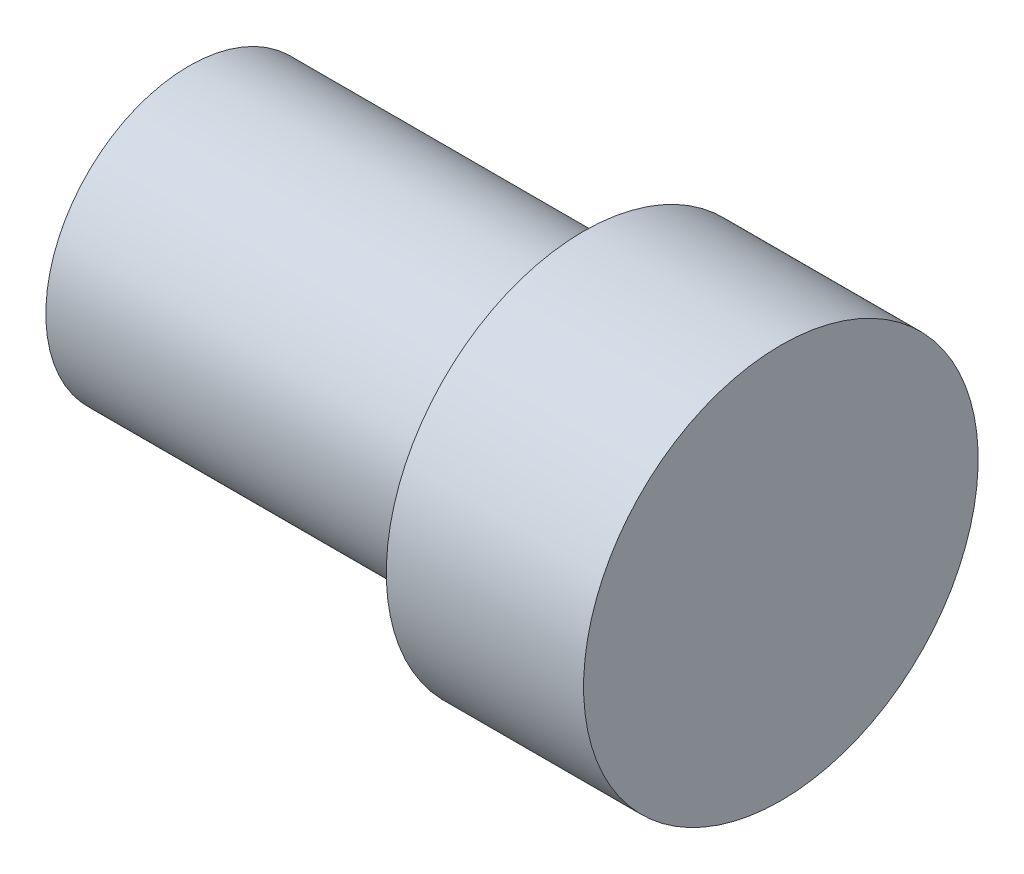
ISO-10303-21;
HEADER;
FILE_DESCRIPTION(('STEP AP214'),'2;1');
FILE_NAME('part.step','',(''),(''),'','','');
FILE_SCHEMA(('AUTOMOTIVE_DESIGN { 1 0 10303 214 1 1 1 1 }'));
ENDSEC;
DATA;
#1=APPLICATION_CONTEXT('core data for automotive mechanical design processes');
#2=APPLICATION_PROTOCOL_DEFINITION('international standard','automotive_design',2000,#1);
#3=PRODUCT_CONTEXT('',#1,'mechanical');
#4=PRODUCT('Part','Part','',(#3));
#5=PRODUCT_RELATED_PRODUCT_CATEGORY('part','',(#4));
#6=PRODUCT_DEFINITION_FORMATION('','',#4);
#7=PRODUCT_DEFINITION_CONTEXT('part definition',#1,'design');
#8=PRODUCT_DEFINITION('design','',#6,#7);
#9=PRODUCT_DEFINITION_SHAPE('','',#8);
#10=(LENGTH_UNIT() NAMED_UNIT(*) SI_UNIT(.MILLI.,.METRE.));
#11=(NAMED_UNIT(*) PLANE_ANGLE_UNIT() SI_UNIT($,.RADIAN.));
#12=(NAMED_UNIT(*) SI_UNIT($,.STERADIAN.) SOLID_ANGLE_UNIT());
#13=UNCERTAINTY_MEASURE_WITH_UNIT(LENGTH_MEASURE(1.E-05),#10,'distance_accuracy_value','');
#14=(GEOMETRIC_REPRESENTATION_CONTEXT(3) GLOBAL_UNCERTAINTY_ASSIGNED_CONTEXT((#13)) GLOBAL_UNIT_ASSIGNED_CONTEXT((#10,
#11,#12)) REPRESENTATION_CONTEXT('',''));
#15=CARTESIAN_POINT('',(0.,0.,0.));
#16=DIRECTION('',(0.,0.,1.));
#17=DIRECTION('',(1.,0.,0.));
#18=AXIS2_PLACEMENT_3D('',#15,#16,#17);
#19=CARTESIAN_POINT('',(0.,-7.25694395995823,0.));
#20=DIRECTION('',(1.,0.,0.));
#21=DIRECTION('',(0.,1.,0.));
#22=AXIS2_PLACEMENT_3D('',#19,#20,#21);
#23=PLANE('',#22);
#24=CARTESIAN_POINT('',(0.,-7.25694395995823,0.));
#25=DIRECTION('',(1.,0.,0.));
#26=DIRECTION('',(0.,1.,0.));
#27=AXIS2_PLACEMENT_3D('',#24,#25,#26);
#28=CIRCLE('',#27,7.25694395995823);
#29=CARTESIAN_POINT('',(0.,0.,0.));
#30=VERTEX_POINT('',#29);
#31=EDGE_CURVE('E10',#30,#30,#28,.T.);
#32=ORIENTED_EDGE('',*,*,#31,.F.);
#33=EDGE_LOOP('',(#32));
#34=FACE_BOUND('',#33,.T.);
#35=ADVANCED_FACE('F31',(#34),#23,.F.);
#36=CARTESIAN_POINT('',(30.,-7.25694395995823,0.));
#37=DIRECTION('',(1.,0.,0.));
#38=DIRECTION('',(0.,1.,0.));
#39=AXIS2_PLACEMENT_3D('',#36,#37,#38);
#40=CYLINDRICAL_SURFACE('',#39,7.25694395995823);
#41=CARTESIAN_POINT('',(20.,-7.25694395995823,0.));
#42=DIRECTION('',(1.,0.,0.));
#43=DIRECTION('',(0.,1.,0.));
#44=AXIS2_PLACEMENT_3D('',#41,#42,#43);
#45=CIRCLE('',#44,7.25694395995823);
#46=CARTESIAN_POINT('',(20.,0.,0.));
#47=VERTEX_POINT('',#46);
#48=EDGE_CURVE('E37',#47,#47,#45,.T.);
#49=ORIENTED_EDGE('',*,*,#48,.F.);
#50=EDGE_LOOP('',(#49));
#51=FACE_BOUND('',#50,.T.);
#52=ORIENTED_EDGE('',*,*,#31,.T.);
#53=EDGE_LOOP('',(#52));
#54=FACE_BOUND('',#53,.T.);
#55=ADVANCED_FACE('F61',(#51,#54),#40,.T.);
#56=CARTESIAN_POINT('',(20.,0.,0.));
#57=DIRECTION('',(1.,0.,0.));
#58=DIRECTION('',(0.,1.,0.));
#59=AXIS2_PLACEMENT_3D('',#56,#57,#58);
#60=PLANE('',#59);
#61=CARTESIAN_POINT('',(20.,-7.25694395995823,0.));
#62=DIRECTION('',(1.,0.,0.));
#63=DIRECTION('',(0.,1.,0.));
#64=AXIS2_PLACEMENT_3D('',#61,#62,#63);
#65=CIRCLE('',#64,10.);
#66=CARTESIAN_POINT('',(20.,2.74305604004177,0.));
#67=VERTEX_POINT('',#66);
#68=EDGE_CURVE('E41',#67,#67,#65,.T.);
#69=ORIENTED_EDGE('',*,*,#68,.F.);
#70=EDGE_LOOP('',(#69));
#71=FACE_BOUND('',#70,.T.);
#72=ORIENTED_EDGE('',*,*,#48,.T.);
#73=EDGE_LOOP('',(#72));
#74=FACE_BOUND('',#73,.T.);
#75=ADVANCED_FACE('F56',(#71,#74),#60,.F.);
#76=CARTESIAN_POINT('',(30.,-7.25694395995823,0.));
#77=DIRECTION('',(1.,0.,0.));
#78=DIRECTION('',(0.,1.,0.));
#79=AXIS2_PLACEMENT_3D('',#76,#77,#78);
#80=CYLINDRICAL_SURFACE('',#79,10.);
#81=CARTESIAN_POINT('',(30.,-7.25694395995823,0.));
#82=DIRECTION('',(1.,0.,0.));
#83=DIRECTION('',(0.,1.,0.));
#84=AXIS2_PLACEMENT_3D('',#81,#82,#83);
#85=CIRCLE('',#84,10.);
#86=CARTESIAN_POINT('',(30.,2.74305604004177,0.));
#87=VERTEX_POINT('',#86);
#88=EDGE_CURVE('E45',#87,#87,#85,.T.);
#89=ORIENTED_EDGE('',*,*,#88,.F.);
#90=EDGE_LOOP('',(#89));
#91=FACE_BOUND('',#90,.T.);
#92=ORIENTED_EDGE('',*,*,#68,.T.);
#93=EDGE_LOOP('',(#92));
#94=FACE_BOUND('',#93,.T.);
#95=ADVANCED_FACE('F53',(#91,#94),#80,.T.);
#96=CARTESIAN_POINT('',(30.,2.74305604004177,0.));
#97=DIRECTION('',(-1.,0.,0.));
#98=DIRECTION('',(0.,-1.,0.));
#99=AXIS2_PLACEMENT_3D('',#96,#97,#98);
#100=PLANE('',#99);
#101=ORIENTED_EDGE('',*,*,#88,.T.);
#102=EDGE_LOOP('',(#101));
#103=FACE_BOUND('',#102,.T.);
#104=ADVANCED_FACE('F51',(#103),#100,.F.);
#105=CLOSED_SHELL('',(#35,#55,#75,#95,#104));
#106=MANIFOLD_SOLID_BREP('B2',#105);
#107=ADVANCED_BREP_SHAPE_REPRESENTATION('',(#18,#106),#14);
#108=SHAPE_DEFINITION_REPRESENTATION(#9,#107);
ENDSEC;
END-ISO-10303-21;
